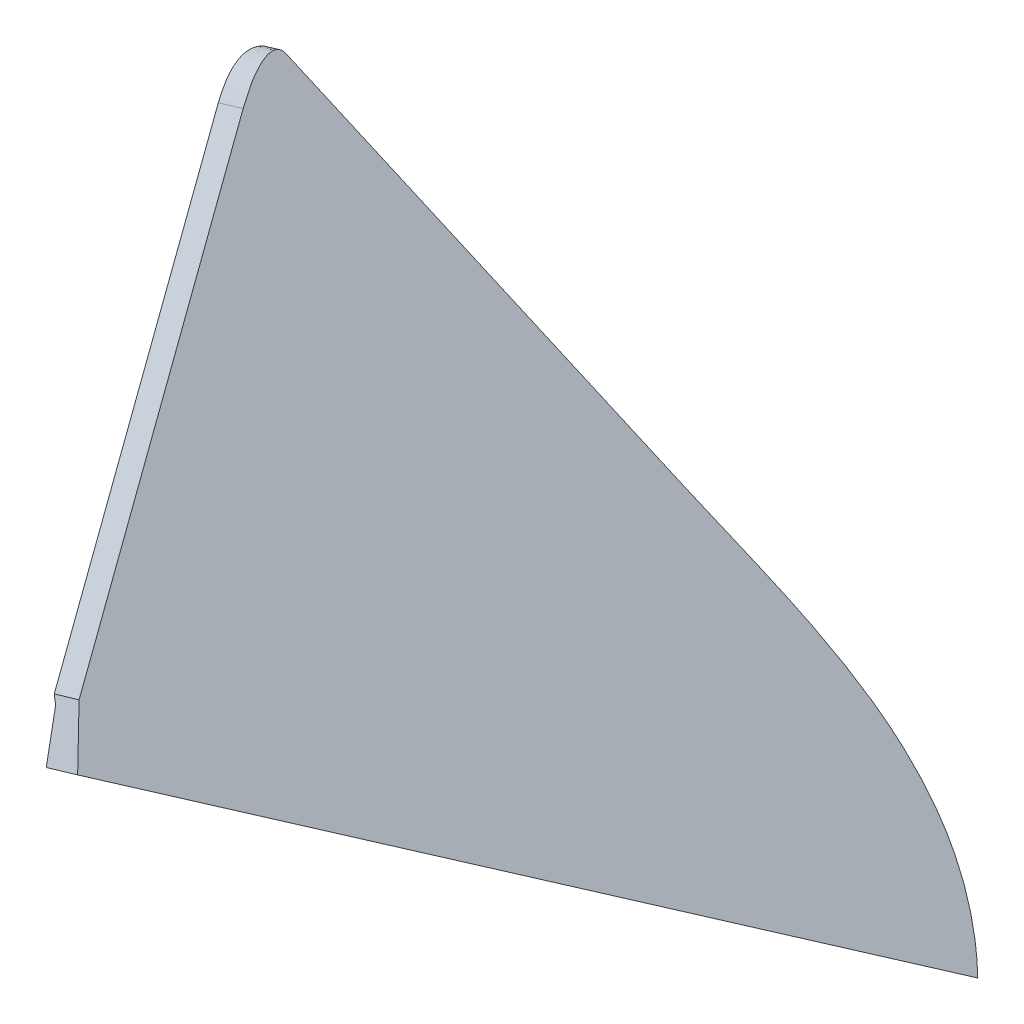
ISO-10303-21;
HEADER;
FILE_DESCRIPTION(('STEP AP214'),'2;1');
FILE_NAME('part.step','',(''),(''),'','','');
FILE_SCHEMA(('AUTOMOTIVE_DESIGN { 1 0 10303 214 1 1 1 1 }'));
ENDSEC;
DATA;
#1=APPLICATION_CONTEXT('core data for automotive mechanical design processes');
#2=APPLICATION_PROTOCOL_DEFINITION('international standard','automotive_design',2000,#1);
#3=PRODUCT_CONTEXT('',#1,'mechanical');
#4=PRODUCT('Part','Part','',(#3));
#5=PRODUCT_RELATED_PRODUCT_CATEGORY('part','',(#4));
#6=PRODUCT_DEFINITION_FORMATION('','',#4);
#7=PRODUCT_DEFINITION_CONTEXT('part definition',#1,'design');
#8=PRODUCT_DEFINITION('design','',#6,#7);
#9=PRODUCT_DEFINITION_SHAPE('','',#8);
#10=(LENGTH_UNIT() NAMED_UNIT(*) SI_UNIT(.MILLI.,.METRE.));
#11=(NAMED_UNIT(*) PLANE_ANGLE_UNIT() SI_UNIT($,.RADIAN.));
#12=(NAMED_UNIT(*) SI_UNIT($,.STERADIAN.) SOLID_ANGLE_UNIT());
#13=UNCERTAINTY_MEASURE_WITH_UNIT(LENGTH_MEASURE(1.E-05),#10,'distance_accuracy_value','');
#14=(GEOMETRIC_REPRESENTATION_CONTEXT(3) GLOBAL_UNCERTAINTY_ASSIGNED_CONTEXT((#13)) GLOBAL_UNIT_ASSIGNED_CONTEXT((#10,
#11,#12)) REPRESENTATION_CONTEXT('',''));
#15=CARTESIAN_POINT('',(0.,0.,0.));
#16=DIRECTION('',(0.,0.,1.));
#17=DIRECTION('',(1.,0.,0.));
#18=AXIS2_PLACEMENT_3D('',#15,#16,#17);
#19=CARTESIAN_POINT('',(-0.166167003981229,22.5936271303822,97.7861143687887));
#20=DIRECTION('',(-0.822868517569812,-0.469108067475573,-0.320663412041027));
#21=DIRECTION('',(0.495261223112808,-0.868744105522912,0.));
#22=AXIS2_PLACEMENT_3D('',#19,#20,#21);
#23=PLANE('',#22);
#24=CARTESIAN_POINT('',(40.5565961621778,10.4622084066012,11.0330508135531));
#25=CARTESIAN_POINT('',(41.72542417795,8.67216391951248,10.6523791746463));
#26=CARTESIAN_POINT('',(42.8644975249842,6.81434647382503,10.4472093849603));
#27=CARTESIAN_POINT('',(43.9154032623933,4.92337098868487,10.5167982697299));
#28=B_SPLINE_CURVE_WITH_KNOTS('',3,(#24,#25,#26,#27),.UNSPECIFIED.,.F.,.F.,(4,4),
(0.209452212312138,0.411613134052495),.UNSPECIFIED.);
#29=CARTESIAN_POINT('',(43.9154032623955,4.92337098868103,10.5167982697301));
#30=VERTEX_POINT('',#29);
#31=CARTESIAN_POINT('',(40.5565961621778,10.4622084066012,11.0330508135532));
#32=VERTEX_POINT('',#31);
#33=EDGE_CURVE('E181',#30,#32,#28,.F.);
#34=ORIENTED_EDGE('',*,*,#33,.T.);
#35=CARTESIAN_POINT('',(35.8873986724663,17.1562236848414,13.2208059075902));
#36=CARTESIAN_POINT('',(36.2893186171553,16.6083020717907,12.9909922859717));
#37=CARTESIAN_POINT('',(37.8568163906146,14.4519584260507,12.1231465691722));
#38=CARTESIAN_POINT('',(39.4147467872617,12.2095351544845,11.4057805712397));
#39=CARTESIAN_POINT('',(40.5484870384322,10.4739598472653,11.0354646043939));
#40=CARTESIAN_POINT('',(40.5562785080976,10.4620273155903,11.0329270270198));
#41=B_SPLINE_CURVE_WITH_KNOTS('',3,(#35,#36,#37,#38,#39,#40),.UNSPECIFIED.,.F.,.F.,(4,1,1,4),
(0.411613134052495,0.478561587695219,0.673272830838195,0.674620446285476),.UNSPECIFIED.);
#42=CARTESIAN_POINT('',(35.8877163265464,17.1564047758523,13.2209296941236));
#43=VERTEX_POINT('',#42);
#44=EDGE_CURVE('E187',#32,#43,#41,.F.);
#45=ORIENTED_EDGE('',*,*,#44,.T.);
#46=CARTESIAN_POINT('',(33.4704175288504,20.4040263738682,14.6730242236566));
#47=CARTESIAN_POINT('',(34.2780692149869,19.3309179907531,14.1703558809761));
#48=CARTESIAN_POINT('',(35.084607138838,18.2512518651785,13.6801391297867));
#49=CARTESIAN_POINT('',(35.8877163265464,17.1564047758522,13.2209296941236));
#50=B_SPLINE_CURVE_WITH_KNOTS('',3,(#46,#47,#48,#49),.UNSPECIFIED.,.F.,.F.,(4,4),
(0.674620446285477,0.808395639414886),.UNSPECIFIED.);
#51=CARTESIAN_POINT('',(33.4704175288504,20.4040263738682,14.6730242236566));
#52=VERTEX_POINT('',#51);
#53=EDGE_CURVE('E200',#43,#52,#50,.F.);
#54=ORIENTED_EDGE('',*,*,#53,.T.);
#55=CARTESIAN_POINT('',(29.9997146201673,24.9998373081739,16.8549175556399));
#56=CARTESIAN_POINT('',(30.1440663964191,24.807865731728,16.7653310427502));
#57=CARTESIAN_POINT('',(30.2884551275735,24.6161245386941,16.6753126634923));
#58=CARTESIAN_POINT('',(30.577347162018,24.2329144448707,16.4945835519247));
#59=CARTESIAN_POINT('',(30.721850488013,24.0414456877086,16.4038725512339));
#60=CARTESIAN_POINT('',(31.0109449568906,23.6586817270501,16.221971302233));
#61=CARTESIAN_POINT('',(31.1555361127854,23.4673866082519,16.1307808966243));
#62=CARTESIAN_POINT('',(31.4447798089459,23.0848708584333,15.9481335938753));
#63=CARTESIAN_POINT('',(31.5894323548886,22.8936502648049,15.8566766274649));
#64=CARTESIAN_POINT('',(31.8787723141187,22.5111845656938,15.6737090791367));
#65=CARTESIAN_POINT('',(32.0234597280094,22.3199394642105,15.5821984898199));
#66=CARTESIAN_POINT('',(32.3128429070866,21.937325737777,15.3993365867208));
#67=CARTESIAN_POINT('',(32.4575386700617,21.7459570982234,15.3079852999772));
#68=CARTESIAN_POINT('',(32.7469120978395,21.3629971798409,15.1256548746427));
#69=CARTESIAN_POINT('',(32.8915897597749,21.1714058822432,15.0346757708676));
#70=CARTESIAN_POINT('',(33.1809002551072,20.7879018711222,14.8533028087476));
#71=CARTESIAN_POINT('',(33.3255330869292,20.595989147554,14.7629089691392));
#72=CARTESIAN_POINT('',(33.470132150544,20.4038636800143,14.6729130131163));
#73=B_SPLINE_CURVE_WITH_KNOTS('',3,(#55,#56,#57,#58,#59,#60,#61,#62,#63,#64,#65,#66,#67,#68,#69,
#70,#71,#72),.UNSPECIFIED.,.F.,.F.,(4,2,2,2,2,2,2,2,4),(0.,0.76905392302072,1.53842272109634,
2.30806204615252,3.07792333052561,3.847955741788,4.6181081333238,5.38833099253364,
6.15857838856899),.UNSPECIFIED.);
#74=CARTESIAN_POINT('',(30.,25.,16.8550287652304));
#75=VERTEX_POINT('',#74);
#76=EDGE_CURVE('E463',#52,#75,#73,.F.);
#77=ORIENTED_EDGE('',*,*,#76,.T.);
#78=DIRECTION('',(-0.562957742526623,0.749727875095895,0.347831415248137));
#79=VECTOR('',#78,1.);
#80=CARTESIAN_POINT('',(33.3004571475762,20.6045640068973,14.8157945671983));
#81=LINE('',#80,#79);
#82=CARTESIAN_POINT('',(11.5058328068315,49.6298995892161,28.2819119265918));
#83=VERTEX_POINT('',#82);
#84=EDGE_CURVE('E306',#75,#83,#81,.T.);
#85=ORIENTED_EDGE('',*,*,#84,.T.);
#86=CARTESIAN_POINT('',(11.4279362314418,49.7283243298604,28.337817274586));
#87=CARTESIAN_POINT('',(11.4539931733448,49.6973187708284,28.3163103641665));
#88=CARTESIAN_POINT('',(11.4800831597117,49.6641536123502,28.297877999319));
#89=CARTESIAN_POINT('',(11.5058328068314,49.6298995892161,28.2819119265918));
#90=B_SPLINE_CURVE_WITH_KNOTS('',3,(#86,#87,#88,#89),.UNSPECIFIED.,.F.,.F.,(4,4),(0.,
0.031626096662793),.UNSPECIFIED.);
#91=CARTESIAN_POINT('',(11.4279362314418,49.7283243298605,28.337817274586));
#92=VERTEX_POINT('',#91);
#93=EDGE_CURVE('E301',#83,#92,#90,.F.);
#94=ORIENTED_EDGE('',*,*,#93,.T.);
#95=CARTESIAN_POINT('',(11.3646138940646,49.7991262724381,28.3967332429226));
#96=CARTESIAN_POINT('',(11.3855654830925,49.7773389111828,28.3748418271681));
#97=CARTESIAN_POINT('',(11.4067399241944,49.7535461443799,28.355312308458));
#98=CARTESIAN_POINT('',(11.4279362314418,49.7283243298604,28.337817274586));
#99=B_SPLINE_CURVE_WITH_KNOTS('',3,(#95,#96,#97,#98),.UNSPECIFIED.,.F.,.F.,(4,4),
(0.031626096662793,0.0573526943731981),.UNSPECIFIED.);
#100=CARTESIAN_POINT('',(11.3646138940569,49.7991262724461,28.3967332429306));
#101=VERTEX_POINT('',#100);
#102=EDGE_CURVE('E303',#92,#101,#99,.F.);
#103=ORIENTED_EDGE('',*,*,#102,.T.);
#104=CARTESIAN_POINT('',(11.2861990886802,49.8714521187899,28.4921492944665));
#105=CARTESIAN_POINT('',(11.3113243232796,49.8516335811628,28.4566674520275));
#106=CARTESIAN_POINT('',(11.3377864197017,49.827023911836,28.4247641189645));
#107=CARTESIAN_POINT('',(11.3646138940646,49.7991262724381,28.3967332429226));
#108=B_SPLINE_CURVE_WITH_KNOTS('',3,(#104,#105,#106,#107),.UNSPECIFIED.,.F.,.F.,(4,4),
(0.0573526943731981,0.0902943313823135),.UNSPECIFIED.);
#109=CARTESIAN_POINT('',(11.2861990886788,49.871452118791,28.4921492944685));
#110=VERTEX_POINT('',#109);
#111=EDGE_CURVE('E568',#101,#110,#108,.F.);
#112=ORIENTED_EDGE('',*,*,#111,.T.);
#113=CARTESIAN_POINT('',(11.2385558355234,49.9040091172962,28.5667801427225));
#114=CARTESIAN_POINT('',(11.2536579019083,49.8954968590968,28.5404789007724));
#115=CARTESIAN_POINT('',(11.2696380866806,49.88451527408,28.5155367323531));
#116=CARTESIAN_POINT('',(11.2861990886802,49.8714521187899,28.4921492944665));
#117=B_SPLINE_CURVE_WITH_KNOTS('',3,(#113,#114,#115,#116),.UNSPECIFIED.,.F.,.F.,(4,4),
(0.0902943313823135,0.11200742282504),.UNSPECIFIED.);
#118=CARTESIAN_POINT('',(11.2385558355224,49.9040091172968,28.5667801427243));
#119=VERTEX_POINT('',#118);
#120=EDGE_CURVE('E570',#110,#119,#117,.F.);
#121=ORIENTED_EDGE('',*,*,#120,.T.);
#122=CARTESIAN_POINT('',(11.1319923180947,49.9214167122341,28.8147713927585));
#123=CARTESIAN_POINT('',(11.1591752345246,49.9325216730133,28.7287703343249));
#124=CARTESIAN_POINT('',(11.1952562836658,49.9284148480045,28.6421891603172));
#125=CARTESIAN_POINT('',(11.2385558355234,49.9040091172962,28.5667801427225));
#126=B_SPLINE_CURVE_WITH_KNOTS('',3,(#122,#123,#124,#125),.UNSPECIFIED.,.F.,.F.,(4,4),
(0.11200742282504,0.174261627312847),.UNSPECIFIED.);
#127=CARTESIAN_POINT('',(11.1319923180946,49.921416712234,28.8147713927588));
#128=VERTEX_POINT('',#127);
#129=EDGE_CURVE('E573',#119,#128,#126,.F.);
#130=ORIENTED_EDGE('',*,*,#129,.T.);
#131=CARTESIAN_POINT('',(11.0716759382309,49.845471399197,29.0806545771656));
#132=CARTESIAN_POINT('',(11.0848765496264,49.8815647998481,28.9939777942388));
#133=CARTESIAN_POINT('',(11.1035706220265,49.9098056762759,28.9046916907016));
#134=CARTESIAN_POINT('',(11.1319923180947,49.9214167122341,28.8147713927585));
#135=B_SPLINE_CURVE_WITH_KNOTS('',3,(#131,#132,#133,#134),.UNSPECIFIED.,.F.,.F.,(4,4),
(0.174261627312847,0.239352879882384),.UNSPECIFIED.);
#136=CARTESIAN_POINT('',(11.071675938231,49.845471399197,29.0806545771656));
#137=VERTEX_POINT('',#136);
#138=EDGE_CURVE('E576',#128,#137,#135,.F.);
#139=ORIENTED_EDGE('',*,*,#138,.T.);
#140=CARTESIAN_POINT('',(11.0658603577472,49.827964655404,29.1211893321512));
#141=CARTESIAN_POINT('',(11.0676749262266,49.8339704431705,29.1077468419712));
#142=CARTESIAN_POINT('',(11.0696080273064,49.8398172718787,29.0942327260063));
#143=CARTESIAN_POINT('',(11.0716759382309,49.845471399197,29.0806545771656));
#144=B_SPLINE_CURVE_WITH_KNOTS('',3,(#140,#141,#142,#143),.UNSPECIFIED.,.F.,.F.,(4,4),
(0.239352879882384,0.249549597916572),.UNSPECIFIED.);
#145=CARTESIAN_POINT('',(11.0658603577484,49.8279646554076,29.1211893321432));
#146=VERTEX_POINT('',#145);
#147=EDGE_CURVE('E579',#137,#146,#144,.F.);
#148=ORIENTED_EDGE('',*,*,#147,.T.);
#149=CARTESIAN_POINT('',(11.0548337914344,49.4012697033857,29.7737098591637));
#150=CARTESIAN_POINT('',(11.0387043273079,49.5673178227106,29.5721836428791));
#151=CARTESIAN_POINT('',(11.0339235458968,49.7222614449201,29.3577801715501));
#152=CARTESIAN_POINT('',(11.0658603577472,49.827964655404,29.1211893321512));
#153=B_SPLINE_CURVE_WITH_KNOTS('',3,(#149,#150,#151,#152),.UNSPECIFIED.,.F.,.F.,(4,4),
(0.249549597916572,0.429014120226688),.UNSPECIFIED.);
#154=CARTESIAN_POINT('',(11.0548337914344,49.4012697033856,29.7737098591638));
#155=VERTEX_POINT('',#154);
#156=EDGE_CURVE('E582',#146,#155,#153,.F.);
#157=ORIENTED_EDGE('',*,*,#156,.T.);
#158=CARTESIAN_POINT('',(11.0661285474859,49.2979891516523,29.895818086647));
#159=CARTESIAN_POINT('',(11.0619088417994,49.3328597481398,29.855633224005));
#160=CARTESIAN_POINT('',(11.0581337943986,49.3672971372993,29.8149410560523));
#161=CARTESIAN_POINT('',(11.0548337914344,49.4012697033857,29.7737098591637));
#162=B_SPLINE_CURVE_WITH_KNOTS('',3,(#158,#159,#160,#161),.UNSPECIFIED.,.F.,.F.,(4,4),
(0.429014120226688,0.465731611331831),.UNSPECIFIED.);
#163=CARTESIAN_POINT('',(11.0661285474859,49.2979891516523,29.895818086647));
#164=VERTEX_POINT('',#163);
#165=EDGE_CURVE('E585',#155,#164,#162,.F.);
#166=ORIENTED_EDGE('',*,*,#165,.T.);
#167=CARTESIAN_POINT('',(11.180200847916,48.6457881921675,30.5572163597114));
#168=CARTESIAN_POINT('',(11.1309593883918,48.8738459888129,30.3499444884607));
#169=CARTESIAN_POINT('',(11.0908889362818,49.093375467492,30.1316148214576));
#170=CARTESIAN_POINT('',(11.0661285474859,49.2979891516523,29.895818086647));
#171=B_SPLINE_CURVE_WITH_KNOTS('',3,(#167,#168,#169,#170),.UNSPECIFIED.,.F.,.F.,(4,4),
(0.465731611331831,0.68118250362839),.UNSPECIFIED.);
#172=CARTESIAN_POINT('',(11.1802008479161,48.6457881921675,30.5572163597114));
#173=VERTEX_POINT('',#172);
#174=EDGE_CURVE('E588',#164,#173,#171,.F.);
#175=ORIENTED_EDGE('',*,*,#174,.T.);
#176=CARTESIAN_POINT('',(11.4391522436959,47.5980431882586,31.4254871769235));
#177=CARTESIAN_POINT('',(11.3460146908039,47.9521680030326,31.1464318058854));
#178=CARTESIAN_POINT('',(11.2530668206482,48.3083153927771,30.8639307963796));
#179=CARTESIAN_POINT('',(11.180200847916,48.6457881921675,30.5572163597114));
#180=B_SPLINE_CURVE_WITH_KNOTS('',3,(#176,#177,#178,#179),.UNSPECIFIED.,.F.,.F.,(4,4),
(0.681182503628389,1.),.UNSPECIFIED.);
#181=CARTESIAN_POINT('',(11.439152243696,47.5980431882586,31.4254871769235));
#182=VERTEX_POINT('',#181);
#183=EDGE_CURVE('E591',#173,#182,#180,.F.);
#184=ORIENTED_EDGE('',*,*,#183,.T.);
#185=DIRECTION('',(0.213079909046091,-0.777878150525178,0.591187394399135));
#186=VECTOR('',#185,1.);
#187=CARTESIAN_POINT('',(10.4010057446425,51.3879428661451,28.5451634217298));
#188=LINE('',#187,#186);
#189=CARTESIAN_POINT('',(18.3733702099096,22.2837060879459,50.6643833731611));
#190=VERTEX_POINT('',#189);
#191=EDGE_CURVE('E195',#182,#190,#188,.T.);
#192=ORIENTED_EDGE('',*,*,#191,.T.);
#193=DIRECTION('',(-0.345662221341984,0.861139754110779,-0.372767960837505));
#194=VECTOR('',#193,1.);
#195=CARTESIAN_POINT('',(3.66637369032536,58.9228832517494,34.8041106440053));
#196=LINE('',#195,#194);
#197=CARTESIAN_POINT('',(19.7550586595642,18.8415397812726,52.154419466463));
#198=VERTEX_POINT('',#197);
#199=EDGE_CURVE('E193',#190,#198,#196,.F.);
#200=ORIENTED_EDGE('',*,*,#199,.T.);
#201=DIRECTION('',(0.515226266862324,-0.377963305323162,-0.769211046309337));
#202=VECTOR('',#201,1.);
#203=CARTESIAN_POINT('',(37.6642612478582,5.70358109916498,25.4167367287374));
#204=LINE('',#203,#202);
#205=CARTESIAN_POINT('',(46.8329384353433,-1.02244154002808,11.7282890965779));
#206=VERTEX_POINT('',#205);
#207=EDGE_CURVE('E66',#198,#206,#204,.T.);
#208=ORIENTED_EDGE('',*,*,#207,.T.);
#209=CARTESIAN_POINT('',(43.9142203662931,4.92269100236904,10.5163365385976));
#210=CARTESIAN_POINT('',(45.0030279447631,2.96351552121229,10.5884356460369));
#211=CARTESIAN_POINT('',(45.9971934735886,0.968747141563538,10.9554698017756));
#212=CARTESIAN_POINT('',(46.8317531629346,-1.02311725046928,11.7278272080907));
#213=B_SPLINE_CURVE_WITH_KNOTS('',3,(#209,#210,#211,#212),.UNSPECIFIED.,.F.,.F.,(4,4),(0.,
0.209452059936682),.UNSPECIFIED.);
#214=EDGE_CURVE('E177',#206,#30,#213,.F.);
#215=ORIENTED_EDGE('',*,*,#214,.T.);
#216=EDGE_LOOP('',(#34,#45,#54,#77,#85,#94,#103,#112,#121,#130,#139,#148,#157,#166,#175,#184,
#192,#200,#208,#215));
#217=FACE_BOUND('',#216,.T.);
#218=ADVANCED_FACE('F42',(#217),#23,.F.);
#219=CARTESIAN_POINT('',(-77.0587228930359,-36.3509059125674,14.4270828842641));
#220=DIRECTION('',(-0.451004469522625,0.195897792022677,0.870757729538622));
#221=DIRECTION('',(0.887962609775484,0.,0.459915648397303));
#222=AXIS2_PLACEMENT_3D('',#219,#220,#221);
#223=PLANE('',#222);
#224=DIRECTION('',(0.635195942336929,-0.614916691346345,0.467336685423222));
#225=VECTOR('',#224,1.);
#226=CARTESIAN_POINT('',(9.78042101705722,25.9071233940204,45.3985352656473));
#227=LINE('',#226,#225);
#228=CARTESIAN_POINT('',(15.3209015538683,20.5435281109171,49.4748676808058));
#229=VERTEX_POINT('',#228);
#230=CARTESIAN_POINT('',(15.7125990587428,20.1643359315404,49.7630537371321));
#231=VERTEX_POINT('',#230);
#232=EDGE_CURVE('E557',#229,#231,#227,.T.);
#233=ORIENTED_EDGE('',*,*,#232,.T.);
#234=DIRECTION('',(-0.0503798148262376,0.968472047635712,-0.243974931512164));
#235=VECTOR('',#234,1.);
#236=CARTESIAN_POINT('',(13.1680481722711,69.0792915706992,37.4405267410063));
#237=LINE('',#236,#235);
#238=CARTESIAN_POINT('',(15.8958590314832,16.6414535695919,50.6505289978586));
#239=VERTEX_POINT('',#238);
#240=EDGE_CURVE('E559',#231,#239,#237,.F.);
#241=ORIENTED_EDGE('',*,*,#240,.T.);
#242=DIRECTION('',(0.822868517569812,0.469108067475573,0.320663412041027));
#243=VECTOR('',#242,1.);
#244=CARTESIAN_POINT('',(-77.0587228930359,-36.3509059125674,14.4270828842641));
#245=LINE('',#244,#243);
#246=EDGE_CURVE('E61',#239,#198,#245,.T.);
#247=ORIENTED_EDGE('',*,*,#246,.T.);
#248=ORIENTED_EDGE('',*,*,#199,.F.);
#249=DIRECTION('',(0.822868517569812,0.469108067475573,0.320663412041027));
#250=VECTOR('',#249,1.);
#251=CARTESIAN_POINT('',(-78.4404113426905,-32.9087396058941,12.9370467909622));
#252=LINE('',#251,#250);
#253=EDGE_CURVE('E361',#229,#190,#252,.T.);
#254=ORIENTED_EDGE('',*,*,#253,.F.);
#255=EDGE_LOOP('',(#233,#241,#247,#248,#254));
#256=FACE_BOUND('',#255,.T.);
#257=ADVANCED_FACE('F223',(#256),#223,.T.);
#258=CARTESIAN_POINT('',(-77.0587228930359,-36.3509059125674,14.4270828842641));
#259=DIRECTION('',(0.239644104303807,-0.798173766080121,0.552710903107494));
#260=DIRECTION('',(0.,-0.569299842046191,-0.822129971382981));
#261=AXIS2_PLACEMENT_3D('',#258,#259,#260);
#262=PLANE('',#261);
#263=DIRECTION('',(0.515226266862324,-0.377963305323161,-0.769211046309336));
#264=VECTOR('',#263,1.);
#265=CARTESIAN_POINT('',(35.7553320455291,4.61532207608679,24.6728466195722));
#266=LINE('',#265,#264);
#267=CARTESIAN_POINT('',(21.3893157854048,15.15404523372,46.1207018813847));
#268=VERTEX_POINT('',#267);
#269=CARTESIAN_POINT('',(44.9240092330141,-2.11070056310627,10.9843989874127));
#270=VERTEX_POINT('',#269);
#271=EDGE_CURVE('E170',#268,#270,#266,.T.);
#272=ORIENTED_EDGE('',*,*,#271,.T.);
#273=DIRECTION('',(0.822868517569812,0.469108067475573,0.320663412041027));
#274=VECTOR('',#273,1.);
#275=CARTESIAN_POINT('',(-49.9808431172567,-56.214887233868,-25.999047485621));
#276=LINE('',#275,#274);
#277=EDGE_CURVE('E166',#270,#206,#276,.T.);
#278=ORIENTED_EDGE('',*,*,#277,.T.);
#279=ORIENTED_EDGE('',*,*,#207,.F.);
#280=ORIENTED_EDGE('',*,*,#246,.F.);
#281=DIRECTION('',(-0.755227358600121,0.204485357577164,0.622749849745805));
#282=VECTOR('',#281,1.);
#283=CARTESIAN_POINT('',(45.3333970805407,8.67094584684382,26.3767494688472));
#284=LINE('',#283,#282);
#285=EDGE_CURVE('E53',#239,#268,#284,.F.);
#286=ORIENTED_EDGE('',*,*,#285,.T.);
#287=EDGE_LOOP('',(#272,#278,#279,#280,#286));
#288=FACE_BOUND('',#287,.T.);
#289=ADVANCED_FACE('F168',(#288),#262,.T.);
#290=CARTESIAN_POINT('',(-49.9808431172567,-56.2148872338681,-25.999047485621));
#291=CARTESIAN_POINT('',(-51.6262811946805,-52.2876792012306,-27.5218460367073));
#292=CARTESIAN_POINT('',(-54.960516409707,-46.4921789113465,-27.4441282596226));
#293=CARTESIAN_POINT('',(-60.8840414380416,-37.9660917370865,-24.7165767256292));
#294=CARTESIAN_POINT('',(-64.4497191852305,-33.3363831854335,-22.3394725668849));
#295=CARTESIAN_POINT('',(-66.8137815526,-30.1924456938399,-20.8723078169686));
#296=B_SPLINE_CURVE_WITH_KNOTS('',3,(#290,#291,#292,#293,#294,#295),.UNSPECIFIED.,.F.,.F.,(4,1,
1,4),(0.,0.412960749499776,0.607671992642753,1.),.UNSPECIFIED.);
#297=DIRECTION('',(0.822868517569812,0.469108067475573,0.320663412041027));
#298=VECTOR('',#297,1.);
#299=SURFACE_OF_LINEAR_EXTRUSION('',#296,#298);
#300=ORIENTED_EDGE('',*,*,#277,.F.);
#301=CARTESIAN_POINT('',(44.9240092330141,-2.11070056310629,10.9843989874127));
#302=CARTESIAN_POINT('',(44.9385596928188,-1.95123439679988,10.9626757657322));
#303=CARTESIAN_POINT('',(44.9522174283998,-1.79150550159015,10.942285343597));
#304=CARTESIAN_POINT('',(44.9777297383192,-1.47183467539899,10.9041965428719));
#305=CARTESIAN_POINT('',(44.9895870599463,-1.31189345243143,10.8864940626961));
#306=CARTESIAN_POINT('',(45.0115131470875,-0.99180120775035,10.8537593410483));
#307=CARTESIAN_POINT('',(45.0215839397715,-0.831650634250068,10.8387240730975));
#308=CARTESIAN_POINT('',(45.0399522652653,-0.511142869056031,10.8113009392612));
#309=CARTESIAN_POINT('',(45.048251121159,-0.350785922106629,10.7989110980677));
#310=CARTESIAN_POINT('',(45.0630905666295,-0.0298685150472454,10.7767564329989));
#311=CARTESIAN_POINT('',(45.0696317955223,0.130691849662952,10.7669906546518));
#312=CARTESIAN_POINT('',(45.0809705987107,0.452003056593494,10.7500623005958));
#313=CARTESIAN_POINT('',(45.085768259881,0.612753888923099,10.7428995951864));
#314=CARTESIAN_POINT('',(45.0936354123436,0.9344555595305,10.7311542689746));
#315=CARTESIAN_POINT('',(45.0967042192693,1.09540645177121,10.7265726699024));
#316=CARTESIAN_POINT('',(45.1011284336024,1.4175078520763,10.7199675048416));
#317=CARTESIAN_POINT('',(45.1024825223927,1.5786584184875,10.7179459074926));
#318=CARTESIAN_POINT('',(45.1034917487701,1.90115867049113,10.7164391751545));
#319=CARTESIAN_POINT('',(45.103144963209,2.06250837515934,10.7169569113444));
#320=CARTESIAN_POINT('',(45.1007672646127,2.38540704085494,10.7205067148826));
#321=CARTESIAN_POINT('',(45.0987338560088,2.54695594272884,10.7235425080096));
#322=CARTESIAN_POINT('',(45.0958673159484,2.70845633332593,10.7278221311983));
#323=B_SPLINE_CURVE_WITH_KNOTS('',3,(#301,#302,#303,#304,#305,#306,#307,#308,#309,#310,#311,
#312,#313,#314,#315,#316,#317,#318,#319,#320,#321,#322),.UNSPECIFIED.,.F.,.F.,(4,2,2,2,2,2,2,2,
2,2,4),(0.,0.48477760213879,0.968807872962693,1.45228535303231,1.9354005539827,2.41833978886846,
2.90125495755962,3.38436115398484,3.86783863357196,4.35186289843632,4.8366046176863),.UNSPECIFIED.);
#324=CARTESIAN_POINT('',(44.9576057817014,-1.72275123301942,10.9342407597945));
#325=VERTEX_POINT('',#324);
#326=EDGE_CURVE('E12',#270,#325,#323,.T.);
#327=ORIENTED_EDGE('',*,*,#326,.T.);
#328=CARTESIAN_POINT('',(45.0826032089166,-2.02028792492613,11.0462014313709));
#329=CARTESIAN_POINT('',(45.0007520363812,-1.82366095413664,10.9702157488685));
#330=CARTESIAN_POINT('',(44.91712243077,-1.62636222819967,10.897952202115));
#331=CARTESIAN_POINT('',(44.7464366701683,-1.23069460526122,10.7608296437075));
#332=CARTESIAN_POINT('',(44.6593807629015,-1.03232578651966,10.6959700980577));
#333=CARTESIAN_POINT('',(44.3937766617537,-0.437159489244886,10.5127848295765));
#334=CARTESIAN_POINT('',(44.2103054969941,-0.0391338478476004,10.4054028361511));
#335=CARTESIAN_POINT('',(43.8317351769015,0.757536709815636,10.2192066643149));
#336=CARTESIAN_POINT('',(43.6366462755905,1.15618078617852,10.1403677160313));
#337=CARTESIAN_POINT('',(43.2408072837573,1.943203805265,10.011363864647));
#338=CARTESIAN_POINT('',(43.0403009433658,2.3316021169976,9.96056366895281));
#339=CARTESIAN_POINT('',(42.630522692759,3.10647207337811,9.88329706217337));
#340=CARTESIAN_POINT('',(42.421245245216,3.49294232316717,9.85684627273214));
#341=CARTESIAN_POINT('',(41.9952244301672,4.26273660226299,9.82665217757078));
#342=CARTESIAN_POINT('',(41.778478870559,4.64605966618567,9.82291559721154));
#343=CARTESIAN_POINT('',(41.2465296306794,5.56854092421378,9.83925166525577));
#344=CARTESIAN_POINT('',(40.9281325627901,6.10568056049062,9.86995913004453));
#345=CARTESIAN_POINT('',(40.2815318751498,7.17057178493396,9.96868984715001));
#346=CARTESIAN_POINT('',(39.9533255884166,7.69832075653758,10.0367233367544));
#347=CARTESIAN_POINT('',(39.2895203311336,8.74384525892066,10.2054723041426));
#348=CARTESIAN_POINT('',(38.9539205553335,9.26161969171247,10.3061913583898));
#349=CARTESIAN_POINT('',(38.2718140278207,10.2955025013636,10.5380138695314));
#350=CARTESIAN_POINT('',(37.9252186584568,10.8114458874041,10.6695862215817));
#351=CARTESIAN_POINT('',(37.2281563836815,11.8333552112206,10.957812266341));
#352=CARTESIAN_POINT('',(36.8776903930018,12.3393234308752,11.1144601463146));
#353=CARTESIAN_POINT('',(36.1739930800503,13.3423166202742,11.4484544463989));
#354=CARTESIAN_POINT('',(35.820761891611,13.839342019048,11.6257998704785));
#355=CARTESIAN_POINT('',(35.0712879619541,14.8828573258675,12.0182891986907));
#356=CARTESIAN_POINT('',(34.6747994133164,15.4284132921169,12.2354321778394));
#357=CARTESIAN_POINT('',(33.8802275676978,16.5118318851525,12.6853695284586));
#358=CARTESIAN_POINT('',(33.4821442130763,17.0496942306,12.9181644705215));
#359=CARTESIAN_POINT('',(32.6849423718727,18.119850617727,13.3949615514171));
#360=CARTESIAN_POINT('',(32.2858236520977,18.6521432386678,13.6389664680865));
#361=CARTESIAN_POINT('',(31.4989698349054,19.6975011018294,14.1263593618108));
#362=CARTESIAN_POINT('',(31.11124804494,20.2106685279846,14.3695511687199));
#363=CARTESIAN_POINT('',(30.3358926392895,21.2357151597954,14.8582281762112));
#364=CARTESIAN_POINT('',(29.948259028856,21.7475946823283,15.103712724278));
#365=CARTESIAN_POINT('',(29.367323416267,22.5160669958784,15.4706999058535));
#366=CARTESIAN_POINT('',(29.1738333502172,22.7722412322532,15.5927787762636));
#367=CARTESIAN_POINT('',(28.7870697683495,23.2851645262758,15.8360741508586));
#368=CARTESIAN_POINT('',(28.5937962538946,23.5419135875118,15.9572906496407));
#369=CARTESIAN_POINT('',(28.4006779341403,23.7990966193511,16.0778357229223));
#370=B_SPLINE_CURVE_WITH_KNOTS('',3,(#328,#329,#330,#331,#332,#333,#334,#335,#336,#337,#338,
#339,#340,#341,#342,#343,#344,#345,#346,#347,#348,#349,#350,#351,#352,#353,#354,#355,#356,#357,
#358,#359,#360,#361,#362,#363,#364,#365,#366,#367,#368,#369),.UNSPECIFIED.,.F.,.F.,(4,2,2,2,2,2,
2,2,2,2,2,2,2,2,2,2,2,2,2,2,4),(0.,0.678313855497362,1.3565787582844,2.70908878868063,
4.06042227111341,5.37972910820656,6.6998817732097,8.0204252979947,9.89441144043743,
11.7689118120972,13.6436173612883,15.5489075517005,17.4537567163954,19.3585142515014,
21.4837556417766,23.6090745498025,25.7349229838215,27.7977473488049,29.8600015132561,
30.890389394027,31.920783724462),.UNSPECIFIED.);
#371=CARTESIAN_POINT('',(28.4006779341402,23.799096619351,16.0778357229223));
#372=VERTEX_POINT('',#371);
#373=EDGE_CURVE('E464',#325,#372,#370,.T.);
#374=ORIENTED_EDGE('',*,*,#373,.T.);
#375=CARTESIAN_POINT('',(28.4006779341403,23.799096619351,16.0778357229223));
#376=CARTESIAN_POINT('',(28.3753453205647,23.8328337280395,16.0936492310809));
#377=CARTESIAN_POINT('',(28.3500094549205,23.8665751677218,16.1094482594292));
#378=CARTESIAN_POINT('',(28.2993312194951,23.9340667090737,16.141017356505));
#379=CARTESIAN_POINT('',(28.2739888497138,23.9678168107433,16.1567874252325));
#380=CARTESIAN_POINT('',(28.248643227864,24.0015712434068,16.1725430141497));
#381=B_SPLINE_CURVE_WITH_KNOTS('',3,(#375,#376,#377,#378,#379,#380),.UNSPECIFIED.,.F.,.F.,(4,2,
4),(0.,0.13516656845774,0.270333136915489),.UNSPECIFIED.);
#382=CARTESIAN_POINT('',(28.248643227864,24.0015712434067,16.1725430141497));
#383=VERTEX_POINT('',#382);
#384=EDGE_CURVE('E455',#372,#383,#381,.T.);
#385=ORIENTED_EDGE('',*,*,#384,.T.);
#386=DIRECTION('',(0.822868517569812,0.469108067475573,0.320663412041027));
#387=VECTOR('',#386,1.);
#388=CARTESIAN_POINT('',(-66.8137815526,-30.1924456938399,-20.8723078169686));
#389=LINE('',#388,#387);
#390=EDGE_CURVE('E174',#383,#75,#389,.T.);
#391=ORIENTED_EDGE('',*,*,#390,.T.);
#392=ORIENTED_EDGE('',*,*,#76,.F.);
#393=ORIENTED_EDGE('',*,*,#53,.F.);
#394=ORIENTED_EDGE('',*,*,#44,.F.);
#395=ORIENTED_EDGE('',*,*,#33,.F.);
#396=ORIENTED_EDGE('',*,*,#214,.F.);
#397=EDGE_LOOP('',(#300,#327,#374,#385,#391,#392,#393,#394,#395,#396));
#398=FACE_BOUND('',#397,.T.);
#399=ADVANCED_FACE('F179',(#398),#299,.T.);
#400=CARTESIAN_POINT('',(-85.3079487457686,-5.56254610462386,-9.44542465560717));
#401=CARTESIAN_POINT('',(-85.3546447277995,-5.50042776795998,-9.4164708046394));
#402=CARTESIAN_POINT('',(-85.4299235752478,-5.40826819073394,-9.35811742932534));
#403=CARTESIAN_POINT('',(-85.5198994080202,-5.3245909394452,-9.24964042452658));
#404=CARTESIAN_POINT('',(-85.6059408800436,-5.26546322887993,-9.11534530110792));
#405=CARTESIAN_POINT('',(-85.6982414265703,-5.25495737603401,-8.89385812515121));
#406=CARTESIAN_POINT('',(-85.78186361386,-5.40518315163336,-8.45950177722584));
#407=CARTESIAN_POINT('',(-85.7598666497148,-6.11809784259651,-7.47300499649864));
#408=CARTESIAN_POINT('',(-85.5414339171305,-6.96018301883892,-6.80162334601279));
#409=CARTESIAN_POINT('',(-85.3746293089041,-7.59440250558137,-6.30184940527546));
#410=B_SPLINE_CURVE_WITH_KNOTS('',3,(#400,#401,#402,#403,#404,#405,#406,#407,#408,#409),
.UNSPECIFIED.,.F.,.F.,(4,1,1,1,1,1,1,4),(0.,0.0573526943731981,0.0902943313823135,
0.11200742282504,0.174261627312847,0.249549597916572,0.429014120226688,1.),.UNSPECIFIED.);
#411=DIRECTION('',(0.822868517569812,0.469108067475573,0.320663412041027));
#412=VECTOR('',#411,1.);
#413=SURFACE_OF_LINEAR_EXTRUSION('',#410,#412);
#414=CARTESIAN_POINT('',(9.75447603469544,48.6314708326228,27.5994261755111));
#415=CARTESIAN_POINT('',(9.74192593256785,48.6481846295738,27.6072191215546));
#416=CARTESIAN_POINT('',(9.72950860324008,48.6647216042486,27.6156586263944));
#417=CARTESIAN_POINT('',(9.70503359595257,48.6973165822022,27.634037013103));
#418=CARTESIAN_POINT('',(9.69297723241863,48.7133728349735,27.6439807259913));
#419=CARTESIAN_POINT('',(9.66925228955831,48.7449689027672,27.6656621669092));
#420=CARTESIAN_POINT('',(9.65759060556218,48.7604995348245,27.6774211325837));
#421=CARTESIAN_POINT('',(9.63502815876047,48.7905474301074,27.7027673660467));
#422=CARTESIAN_POINT('',(9.62412634288521,48.8050660957752,27.7163520239711));
#423=CARTESIAN_POINT('',(9.5991876435948,48.8382786028844,27.7510753173759));
#424=CARTESIAN_POINT('',(9.58558461140976,48.8563946560929,27.7730947054928));
#425=CARTESIAN_POINT('',(9.56081404432329,48.8893832504851,27.8204458574037));
#426=CARTESIAN_POINT('',(9.54963106710472,48.9042763572189,27.8457548632943));
#427=CARTESIAN_POINT('',(9.53501753423075,48.923738160693,27.8859252085813));
#428=CARTESIAN_POINT('',(9.5305001367897,48.9297542761648,27.8997108287962));
#429=CARTESIAN_POINT('',(9.52222774226814,48.9407711683724,27.9279038537851));
#430=CARTESIAN_POINT('',(9.51847288683113,48.9457717564723,27.9423113734766));
#431=CARTESIAN_POINT('',(9.50825812074136,48.9593754327279,27.9863567779179));
#432=CARTESIAN_POINT('',(9.50288699555047,48.9665285136292,28.0167070347606));
#433=CARTESIAN_POINT('',(9.49559510192522,48.9762396082641,28.0718877899703));
#434=CARTESIAN_POINT('',(9.49318898632422,48.9794439907612,28.0965530362585));
#435=CARTESIAN_POINT('',(9.48990294785889,48.9838202244462,28.1459442076141));
#436=CARTESIAN_POINT('',(9.48900956133585,48.9850100060745,28.1706676148846));
#437=CARTESIAN_POINT('',(9.4887992058347,48.9852901503393,28.1953967676316));
#438=B_SPLINE_CURVE_WITH_KNOTS('',3,(#414,#415,#416,#417,#418,#419,#420,#421,#422,#423,#424,
#425,#426,#427,#428,#429,#430,#431,#432,#433,#434,#435,#436,#437),.UNSPECIFIED.,.F.,.F.,(4,2,2,
2,2,2,2,2,2,2,2,4),(0.,0.0669372428573807,0.134094218728702,0.202106592800258,0.270022755944454,
0.364405479256265,0.458166925522348,0.505222962510744,0.552287732261075,0.646796766526371,
0.721644087547428,0.795821677977686),.UNSPECIFIED.);
#439=CARTESIAN_POINT('',(9.75447603469547,48.6314708326228,27.5994261755111));
#440=VERTEX_POINT('',#439);
#441=CARTESIAN_POINT('',(9.53023116854623,48.9301124788522,27.9010635611751));
#442=VERTEX_POINT('',#441);
#443=EDGE_CURVE('E436',#440,#442,#438,.T.);
#444=ORIENTED_EDGE('',*,*,#443,.T.);
#445=CARTESIAN_POINT('',(10.3967999107725,48.9976524348669,27.849733194604));
#446=CARTESIAN_POINT('',(10.3287318308349,49.0022458604607,27.8462421911526));
#447=CARTESIAN_POINT('',(10.260389227708,49.0049491750718,27.8441876720483));
#448=CARTESIAN_POINT('',(10.1233879857387,49.0059615582175,27.8434182608575));
#449=CARTESIAN_POINT('',(10.0547291813316,49.0042529095935,27.8447168338117));
#450=CARTESIAN_POINT('',(9.91738481282847,48.9957494576398,27.8511794572965));
#451=CARTESIAN_POINT('',(9.8487027119198,48.988917617963,27.8563716554509));
#452=CARTESIAN_POINT('',(9.71263179208623,48.9697741876409,27.8709206624957));
#453=CARTESIAN_POINT('',(9.64524083508552,48.9574726551069,27.8802698272216));
#454=CARTESIAN_POINT('',(9.556591627757,48.9368614989126,27.8959343059292));
#455=CARTESIAN_POINT('',(9.5343051685207,48.9312940142092,27.9001655943038));
#456=CARTESIAN_POINT('',(9.49004503824754,48.9194211797938,27.9091889484595));
#457=CARTESIAN_POINT('',(9.46807135502392,48.9131158589191,27.9139809923242));
#458=CARTESIAN_POINT('',(9.40264577714598,48.8931393459029,27.9291631422166));
#459=CARTESIAN_POINT('',(9.3596965186601,48.8784092758036,27.9403579954921));
#460=CARTESIAN_POINT('',(9.27560439239187,48.8463422977764,27.9647288987927));
#461=CARTESIAN_POINT('',(9.23445430670049,48.8290173396359,27.9778958669795));
#462=CARTESIAN_POINT('',(9.15408390332589,48.7917377469391,28.0062283574291));
#463=CARTESIAN_POINT('',(9.11486298608472,48.7717839365751,28.0213932533057));
#464=CARTESIAN_POINT('',(9.0386970583578,48.7290972789391,28.053835113109));
#465=CARTESIAN_POINT('',(9.00175938989685,48.7063561035651,28.0711184063933));
#466=CARTESIAN_POINT('',(8.93058907609377,48.6583311011227,28.1076174082495));
#467=CARTESIAN_POINT('',(8.89635667907796,48.633047041117,28.1268332938539));
#468=CARTESIAN_POINT('',(8.83066510405954,48.5802279950231,28.1669757688852));
#469=CARTESIAN_POINT('',(8.79921027948222,48.5526896013534,28.1879049480742));
#470=CARTESIAN_POINT('',(8.73884821785184,48.4958937842166,28.2310697690982));
#471=CARTESIAN_POINT('',(8.70994166368377,48.4666359034414,28.2533057584873));
#472=CARTESIAN_POINT('',(8.65409461740912,48.4057567705899,28.2995738994545));
#473=CARTESIAN_POINT('',(8.62722613291479,48.3740935272003,28.3236379644306));
#474=CARTESIAN_POINT('',(8.57654284548705,48.3092729786743,28.3729015813103));
#475=CARTESIAN_POINT('',(8.55272678631359,48.2761162958119,28.3981006602858));
#476=CARTESIAN_POINT('',(8.50818524311466,48.2085483951619,28.4494522647797));
#477=CARTESIAN_POINT('',(8.48745741976056,48.1741381517871,28.4756040497446));
#478=CARTESIAN_POINT('',(8.44894161060187,48.1042785467705,28.5286973495572));
#479=CARTESIAN_POINT('',(8.4311548648921,48.0688287541861,28.5556391919213));
#480=CARTESIAN_POINT('',(8.39898614489726,47.9987499104085,28.6088991131924));
#481=CARTESIAN_POINT('',(8.38448808392083,47.9641542757309,28.6351917955473));
#482=CARTESIAN_POINT('',(8.35752484503702,47.8944590693597,28.6881601523894));
#483=CARTESIAN_POINT('',(8.34506028427834,47.8593593481838,28.7148359404831));
#484=CARTESIAN_POINT('',(8.32182578677649,47.7887794084737,28.7684766946628));
#485=CARTESIAN_POINT('',(8.31105711046707,47.7532989276714,28.7954418600725));
#486=CARTESIAN_POINT('',(8.29127831970113,47.682036073834,28.8496016289889));
#487=CARTESIAN_POINT('',(8.28226792155836,47.6462537504727,28.8767961947436));
#488=CARTESIAN_POINT('',(8.25769158462387,47.5379050602184,28.9591411993368));
#489=CARTESIAN_POINT('',(8.2447806737876,47.4649467102791,29.0145895452907));
#490=CARTESIAN_POINT('',(8.22566231725393,47.3185577918975,29.1258451232607));
#491=CARTESIAN_POINT('',(8.21944943008901,47.2451276555995,29.1816520268472));
#492=CARTESIAN_POINT('',(8.21142218084198,47.0598933194256,29.3224301223393));
#493=CARTESIAN_POINT('',(8.21357208394258,46.947979859638,29.4074843517779));
#494=CARTESIAN_POINT('',(8.22884534334047,46.7246112175452,29.5772445197684));
#495=CARTESIAN_POINT('',(8.24197874267847,46.6131565485104,29.6619500682349));
#496=CARTESIAN_POINT('',(8.26707660089458,46.4479839391354,29.7874812513599));
#497=CARTESIAN_POINT('',(8.27618635860697,46.3939695653327,29.82853217545));
#498=CARTESIAN_POINT('',(8.2957688423892,46.2861254097631,29.9104937336829));
#499=CARTESIAN_POINT('',(8.30624090452052,46.2322955511018,29.9514044262654));
#500=CARTESIAN_POINT('',(8.33899722888158,46.0714526697964,30.0736450160576));
#501=CARTESIAN_POINT('',(8.36270021684764,45.9646168730502,30.1548402215846));
#502=CARTESIAN_POINT('',(8.38668358765467,45.8578652112298,30.2359714845681));
#503=B_SPLINE_CURVE_WITH_KNOTS('',3,(#445,#446,#447,#448,#449,#450,#451,#452,#453,#454,#455,
#456,#457,#458,#459,#460,#461,#462,#463,#464,#465,#466,#467,#468,#469,#470,#471,#472,#473,#474,
#475,#476,#477,#478,#479,#480,#481,#482,#483,#484,#485,#486,#487,#488,#489,#490,#491,#492,#493,
#494,#495,#496,#497,#498,#499,#500,#501,#502),.UNSPECIFIED.,.F.,.F.,(4,2,2,2,2,2,2,2,2,2,2,2,2,
2,2,2,2,2,2,2,2,2,2,2,2,2,2,2,4),(0.,0.20500816760722,0.410840867428792,0.618176083802682,
0.825131602236555,0.895188498588921,0.965242657782956,1.10537330624518,1.24487742220087,
1.38433790472896,1.5242257183828,1.6641263579496,1.80424251654753,1.94439611002273,
2.0882480269743,2.23204054957457,2.37572358988626,2.51946705999622,2.65682997997122,
2.79423451109281,2.9317406883913,3.06922466162487,3.34656086342943,3.62367158741234,
4.04480504698483,4.46632400226688,4.67167005731271,4.87691640635454,5.28562500552937),.UNSPECIFIED.);
#504=CARTESIAN_POINT('',(8.38668358765467,45.8578652112298,30.2359714845681));
#505=VERTEX_POINT('',#504);
#506=EDGE_CURVE('E429',#442,#505,#503,.T.);
#507=ORIENTED_EDGE('',*,*,#506,.T.);
#508=DIRECTION('',(0.822868517569812,0.469108067475573,0.320663412041027));
#509=VECTOR('',#508,1.);
#510=CARTESIAN_POINT('',(-85.3746293089041,-7.59440250558137,-6.30184940527546));
#511=LINE('',#510,#509);
#512=EDGE_CURVE('E438',#505,#182,#511,.T.);
#513=ORIENTED_EDGE('',*,*,#512,.T.);
#514=ORIENTED_EDGE('',*,*,#183,.F.);
#515=ORIENTED_EDGE('',*,*,#174,.F.);
#516=ORIENTED_EDGE('',*,*,#165,.F.);
#517=ORIENTED_EDGE('',*,*,#156,.F.);
#518=ORIENTED_EDGE('',*,*,#147,.F.);
#519=ORIENTED_EDGE('',*,*,#138,.F.);
#520=ORIENTED_EDGE('',*,*,#129,.F.);
#521=ORIENTED_EDGE('',*,*,#120,.F.);
#522=ORIENTED_EDGE('',*,*,#111,.F.);
#523=ORIENTED_EDGE('',*,*,#102,.F.);
#524=ORIENTED_EDGE('',*,*,#93,.F.);
#525=DIRECTION('',(0.822868517569812,0.469108067475573,0.320663412041027));
#526=VECTOR('',#525,1.);
#527=CARTESIAN_POINT('',(-85.3079487457686,-5.56254610462385,-9.44542465560717));
#528=LINE('',#527,#526);
#529=EDGE_CURVE('E482',#440,#83,#528,.T.);
#530=ORIENTED_EDGE('',*,*,#529,.F.);
#531=EDGE_LOOP('',(#444,#507,#513,#514,#515,#516,#517,#518,#519,#520,#521,#522,#523,#524,#530));
#532=FACE_BOUND('',#531,.T.);
#533=ADVANCED_FACE('F344',(#532),#413,.T.);
#534=CARTESIAN_POINT('',(-78.4404113426905,-32.9087396058941,12.9370467909622));
#535=DIRECTION('',(-0.526767838002065,0.418142564163065,0.740048944923083));
#536=DIRECTION('',(0.814689658210966,0.,0.579897198479265));
#537=AXIS2_PLACEMENT_3D('',#534,#535,#536);
#538=PLANE('',#537);
#539=DIRECTION('',(0.213079909046091,-0.777878150525178,0.591187394399135));
#540=VECTOR('',#539,1.);
#541=CARTESIAN_POINT('',(7.34853708860123,49.6477648891163,27.3556477293744));
#542=LINE('',#541,#540);
#543=EDGE_CURVE('E446',#505,#229,#542,.T.);
#544=ORIENTED_EDGE('',*,*,#543,.T.);
#545=ORIENTED_EDGE('',*,*,#253,.T.);
#546=ORIENTED_EDGE('',*,*,#191,.F.);
#547=ORIENTED_EDGE('',*,*,#512,.F.);
#548=EDGE_LOOP('',(#544,#545,#546,#547));
#549=FACE_BOUND('',#548,.T.);
#550=ADVANCED_FACE('F369',(#549),#538,.T.);
#551=CARTESIAN_POINT('',(-85.3079487457686,-5.56254610462385,-9.44542465560717));
#552=DIRECTION('',(0.0772397755161718,0.466739471582945,-0.881015483828));
#553=DIRECTION('',(0.,0.883655363491066,0.468138012314181));
#554=AXIS2_PLACEMENT_3D('',#551,#552,#553);
#555=PLANE('',#554);
#556=DIRECTION('',(-0.562957742526623,0.749727875095895,0.347831415248137));
#557=VECTOR('',#556,1.);
#558=CARTESIAN_POINT('',(31.5491003754402,19.6061352503041,14.1333088161176));
#559=LINE('',#558,#557);
#560=EDGE_CURVE('E437',#383,#440,#559,.T.);
#561=ORIENTED_EDGE('',*,*,#560,.T.);
#562=ORIENTED_EDGE('',*,*,#529,.T.);
#563=ORIENTED_EDGE('',*,*,#84,.F.);
#564=ORIENTED_EDGE('',*,*,#390,.F.);
#565=EDGE_LOOP('',(#561,#562,#563,#564));
#566=FACE_BOUND('',#565,.T.);
#567=ADVANCED_FACE('F345',(#566),#555,.T.);
#568=CARTESIAN_POINT('',(-1.81190403912085,21.6554109954311,97.1447875447067));
#569=DIRECTION('',(-0.822868517569812,-0.469108067475573,-0.320663412041027));
#570=DIRECTION('',(0.495261223112808,-0.868744105522912,0.));
#571=AXIS2_PLACEMENT_3D('',#568,#569,#570);
#572=PLANE('',#571);
#573=DIRECTION('',(0.515226266862324,-0.377963305323162,-0.769211046309337));
#574=VECTOR('',#573,1.);
#575=CARTESIAN_POINT('',(35.8881073315529,5.1997396528918,24.47461872776));
#576=LINE('',#575,#574);
#577=CARTESIAN_POINT('',(21.6420283545841,15.6504783755524,45.7434126935921));
#578=VERTEX_POINT('',#577);
#579=CARTESIAN_POINT('',(44.7891230266751,-1.32992998788513,11.1857783940617));
#580=VERTEX_POINT('',#579);
#581=EDGE_CURVE('E186',#578,#580,#576,.T.);
#582=ORIENTED_EDGE('',*,*,#581,.F.);
#583=DIRECTION('',(0.553428001528997,-0.789599481927916,-0.265047364187584));
#584=VECTOR('',#583,1.);
#585=CARTESIAN_POINT('',(4.29463198870792,40.4007532901771,54.0514160284249));
#586=LINE('',#585,#584);
#587=CARTESIAN_POINT('',(16.8761868961555,22.4501089257399,48.0258662615405));
#588=VERTEX_POINT('',#587);
#589=EDGE_CURVE('E311',#578,#588,#586,.F.);
#590=ORIENTED_EDGE('',*,*,#589,.T.);
#591=DIRECTION('',(0.213079909046091,-0.777878150525178,0.591187394399135));
#592=VECTOR('',#591,1.);
#593=CARTESIAN_POINT('',(9.33175483353834,49.9921183338725,27.0939391113597));
#594=LINE('',#593,#592);
#595=CARTESIAN_POINT('',(9.67575007134893,48.7363153791242,28.0483493569684));
#596=VERTEX_POINT('',#595);
#597=EDGE_CURVE('E626',#596,#588,#594,.T.);
#598=ORIENTED_EDGE('',*,*,#597,.F.);
#599=DIRECTION('',(-0.562957742526623,0.749727875095895,0.347831415248137));
#600=VECTOR('',#599,1.);
#601=CARTESIAN_POINT('',(31.6274811996218,19.5017503483428,14.4851613435578));
#602=LINE('',#601,#600);
#603=CARTESIAN_POINT('',(28.4006779341403,23.7990966193511,16.4788874472656));
#604=VERTEX_POINT('',#603);
#605=EDGE_CURVE('E618',#604,#596,#602,.T.);
#606=ORIENTED_EDGE('',*,*,#605,.F.);
#607=CARTESIAN_POINT('',(44.7891230266751,-1.32992998788513,11.1857783940617));
#608=CARTESIAN_POINT('',(44.7049911312404,-1.1360165821554,11.1179912561267));
#609=CARTESIAN_POINT('',(44.6192244661105,-0.941616617196171,11.0536873707666));
#610=CARTESIAN_POINT('',(44.4445446021779,-0.552062434788705,10.9320506403571));
#611=CARTESIAN_POINT('',(44.3556315520706,-0.356908253371355,10.874717466444));
#612=CARTESIAN_POINT('',(44.0848089498973,0.228382570741853,10.7134478850253));
#613=CARTESIAN_POINT('',(43.8983832157034,0.619344135937949,10.6198938478421));
#614=CARTESIAN_POINT('',(43.5149132167353,1.40118903247542,10.4601489035376));
#615=CARTESIAN_POINT('',(43.317877293144,1.79207218963402,10.3939368465566));
#616=CARTESIAN_POINT('',(42.9190362528783,2.56344276766882,10.2889594018094));
#617=CARTESIAN_POINT('',(42.7174476094357,2.94396110561836,10.2495932830318));
#618=CARTESIAN_POINT('',(42.306378658567,3.70266790115003,10.1945206437813));
#619=CARTESIAN_POINT('',(42.0968942098404,4.08085501154366,10.1788267213245));
#620=CARTESIAN_POINT('',(41.6712756799227,4.83379422610639,10.169527964452));
#621=CARTESIAN_POINT('',(41.4551402120541,5.20854559252387,10.1759277677294));
#622=CARTESIAN_POINT('',(40.9116685932597,6.13372917446607,10.217075596319));
#623=CARTESIAN_POINT('',(40.580999133907,6.68167657344469,10.2640124835499));
#624=CARTESIAN_POINT('',(39.9104177339565,7.76723231793627,10.3967291061942));
#625=CARTESIAN_POINT('',(39.5705018146273,8.30483603712003,10.4825258196007));
#626=CARTESIAN_POINT('',(38.8838532532551,9.36934462393478,10.687263608044));
#627=CARTESIAN_POINT('',(38.537119037359,9.89624696295196,10.8062124209992));
#628=CARTESIAN_POINT('',(37.8331951398052,10.947903656342,11.0740826293006));
#629=CARTESIAN_POINT('',(37.4759269011406,11.4724897797576,11.2234517233295));
#630=CARTESIAN_POINT('',(36.757918789687,12.5115497010255,11.5458922473652));
#631=CARTESIAN_POINT('',(36.3971801312154,13.0260268571479,11.7189556483454));
#632=CARTESIAN_POINT('',(35.6732095023019,14.0461845055906,12.0843495498541));
#633=CARTESIAN_POINT('',(35.3099777268001,14.5518656749957,12.2766785596106));
#634=CARTESIAN_POINT('',(34.579731341535,15.5586652862228,12.6777188271215));
#635=CARTESIAN_POINT('',(34.2127069447308,16.0597421128556,12.8865160799343));
#636=CARTESIAN_POINT('',(33.4774833800285,17.0559744757793,13.3157876496625));
#637=CARTESIAN_POINT('',(33.1092841950469,17.5511299254611,13.5362621371196));
#638=CARTESIAN_POINT('',(32.3720939288241,18.5372557695003,13.985365674165));
#639=CARTESIAN_POINT('',(32.0031027259242,19.0282254532194,14.2139960755612));
#640=CARTESIAN_POINT('',(31.2746852793411,19.9944919320813,14.6696401509063));
#641=CARTESIAN_POINT('',(30.9152692326004,20.469854546906,14.8965313684566));
#642=CARTESIAN_POINT('',(30.1964198543467,21.4199459278902,15.3512854348865));
#643=CARTESIAN_POINT('',(29.83698653752,21.8946747925193,15.5791481020247));
#644=CARTESIAN_POINT('',(29.2980805107623,22.6077406892294,15.9188932505771));
#645=CARTESIAN_POINT('',(29.1185261368874,22.8455378900953,16.0317750286191));
#646=CARTESIAN_POINT('',(28.7595160076153,23.3217703632977,16.2563520616996));
#647=CARTESIAN_POINT('',(28.5800602533409,23.5602056427261,16.3680473034813));
#648=CARTESIAN_POINT('',(28.4006779341403,23.7990966193511,16.4788874472656));
#649=B_SPLINE_CURVE_WITH_KNOTS('',3,(#607,#608,#609,#610,#611,#612,#613,#614,#615,#616,#617,
#618,#619,#620,#621,#622,#623,#624,#625,#626,#627,#628,#629,#630,#631,#632,#633,#634,#635,#636,
#637,#638,#639,#640,#641,#642,#643,#644,#645,#646,#647,#648),.UNSPECIFIED.,.F.,.F.,(4,2,2,2,2,2,
2,2,2,2,2,2,2,2,2,2,2,2,2,2,4),(0.,0.665873212741707,1.33171499878377,2.65998364075926,
3.9872228928435,5.28369163314159,6.5808500930674,7.87828085602493,9.80176637518952,
11.7260930837229,13.6508693194746,15.6063381534933,17.561145992008,19.5158026842365,
21.4814447424023,23.4471155159669,25.4131136187721,27.3261331463564,29.2388092450216,
30.1947178926235,31.1506372090809),.UNSPECIFIED.);
#650=EDGE_CURVE('E527',#580,#604,#649,.T.);
#651=ORIENTED_EDGE('',*,*,#650,.F.);
#652=EDGE_LOOP('',(#582,#590,#598,#606,#651));
#653=FACE_BOUND('',#652,.T.);
#654=ADVANCED_FACE('F522',(#653),#572,.T.);
#655=CARTESIAN_POINT('',(46.0952796189807,63.686887457325,9.23574179144483));
#656=DIRECTION('',(-0.655329580001053,-0.216398130270916,-0.723681553441081));
#657=DIRECTION('',(-0.375614540654773,-0.737863997587318,0.560776638166362));
#658=AXIS2_PLACEMENT_3D('',#655,#656,#657);
#659=PLANE('',#658);
#660=ORIENTED_EDGE('',*,*,#240,.F.);
#661=DIRECTION('',(-0.375614540654773,-0.737863997587318,0.560776638166362));
#662=VECTOR('',#661,1.);
#663=CARTESIAN_POINT('',(10.6520994834319,10.223399034053,57.3181657792225));
#664=LINE('',#663,#662);
#665=EDGE_CURVE('E323',#588,#231,#664,.T.);
#666=ORIENTED_EDGE('',*,*,#665,.F.);
#667=ORIENTED_EDGE('',*,*,#589,.F.);
#668=DIRECTION('',(0.375614540654773,0.737863997587318,-0.560776638166362));
#669=VECTOR('',#668,1.);
#670=CARTESIAN_POINT('',(20.7255416925042,13.8501153996172,47.1116885553028));
#671=LINE('',#670,#669);
#672=EDGE_CURVE('E315',#268,#578,#671,.T.);
#673=ORIENTED_EDGE('',*,*,#672,.F.);
#674=ORIENTED_EDGE('',*,*,#285,.F.);
#675=EDGE_LOOP('',(#660,#666,#667,#673,#674));
#676=FACE_BOUND('',#675,.T.);
#677=ADVANCED_FACE('F44',(#676),#659,.T.);
#678=CARTESIAN_POINT('',(48.3383150777747,60.,5.88698462757739));
#679=DIRECTION('',(0.830842461112662,0.,0.5565076862113));
#680=DIRECTION('',(0.5565076862113,0.,-0.830842461112662));
#681=AXIS2_PLACEMENT_3D('',#678,#679,#680);
#682=PLANE('',#681);
#683=ORIENTED_EDGE('',*,*,#326,.F.);
#684=ORIENTED_EDGE('',*,*,#271,.F.);
#685=ORIENTED_EDGE('',*,*,#672,.T.);
#686=ORIENTED_EDGE('',*,*,#581,.T.);
#687=CARTESIAN_POINT('',(44.7891230266751,-1.32992998788513,11.1857783940617));
#688=CARTESIAN_POINT('',(44.9379919287355,-1.67309662130439,10.9635234135186));
#689=CARTESIAN_POINT('',(45.0841382371347,-2.02014354113209,10.7453331502725));
#690=CARTESIAN_POINT('',(45.3704546289111,-2.723265443231,10.3178748752217));
#691=CARTESIAN_POINT('',(45.5106109308011,-3.0793585241142,10.108627438595));
#692=CARTESIAN_POINT('',(45.7838611834676,-3.80061701352476,9.7006763571452));
#693=CARTESIAN_POINT('',(45.9169496719333,-4.16578912772042,9.50198086732116));
#694=CARTESIAN_POINT('',(46.1775058171904,-4.91281884821876,9.11298155186292));
#695=CARTESIAN_POINT('',(46.3048073196496,-5.29486419009622,8.92292578762603));
#696=CARTESIAN_POINT('',(46.5495333345588,-6.06875595568866,8.55756018789876));
#697=CARTESIAN_POINT('',(46.6669641070503,-6.46059595985334,8.38224100643074));
#698=CARTESIAN_POINT('',(46.8905385796873,-7.25438442641543,8.04845376558904));
#699=CARTESIAN_POINT('',(46.9966866122706,-7.65632893495818,7.88997923806866));
#700=CARTESIAN_POINT('',(47.209853819631,-8.52662888210568,7.57172960454139));
#701=CARTESIAN_POINT('',(47.3149755239785,-8.99650033820868,7.41478734171117));
#702=CARTESIAN_POINT('',(47.5058005648073,-9.94875725158158,7.12989361878087));
#703=CARTESIAN_POINT('',(47.5915087417428,-10.431139555966,7.00193493208704));
#704=CARTESIAN_POINT('',(47.7400748811025,-11.4033744084978,6.78013196346331));
#705=CARTESIAN_POINT('',(47.8031028546269,-11.8931414253761,6.68603386214426));
#706=CARTESIAN_POINT('',(47.8790789263913,-12.6336544993336,6.57260479725533));
#707=CARTESIAN_POINT('',(47.9013066033032,-12.8814041551124,6.53941981482321));
#708=CARTESIAN_POINT('',(47.9392860612925,-13.3784971246616,6.48271808881044));
#709=CARTESIAN_POINT('',(47.9550386552762,-13.6278402343898,6.45920013159503));
#710=CARTESIAN_POINT('',(47.9767790388022,-14.06672219549,6.42674265759816));
#711=CARTESIAN_POINT('',(47.9842107351229,-14.2560338580446,6.41564744900652));
#712=CARTESIAN_POINT('',(47.9951282031477,-14.6353087927026,6.3993481305469));
#713=CARTESIAN_POINT('',(47.9986080227946,-14.8252726166125,6.39415290684861));
#714=CARTESIAN_POINT('',(48.0000585172765,-15.0152992052638,6.3919873798756));
#715=B_SPLINE_CURVE_WITH_KNOTS('',3,(#687,#688,#689,#690,#691,#692,#693,#694,#695,#696,#697,
#698,#699,#700,#701,#702,#703,#704,#705,#706,#707,#708,#709,#710,#711,#712,#713,#714),
.UNSPECIFIED.,.F.,.F.,(4,2,2,2,2,2,2,2,2,2,2,2,2,4),(0.,1.30536996360439,2.6135972317396,
3.92282126444504,5.25828983250343,6.59290495024099,7.92700572607954,9.44503420604082,
10.9626837720793,12.468707618464,13.221328576081,13.9738550179486,14.5430752108849,
15.1131515935892),.UNSPECIFIED.);
#716=EDGE_CURVE('E540',#580,#325,#715,.T.);
#717=ORIENTED_EDGE('',*,*,#716,.T.);
#718=EDGE_LOOP('',(#683,#684,#685,#686,#717));
#719=FACE_BOUND('',#718,.T.);
#720=ADVANCED_FACE('F336',(#719),#682,.F.);
#721=CARTESIAN_POINT('',(60.,58.7898334649329,20.4076756117538));
#722=DIRECTION('',(0.,0.605083267533558,0.796162194123103));
#723=DIRECTION('',(0.,-0.796162194123103,0.605083267533558));
#724=AXIS2_PLACEMENT_3D('',#721,#722,#723);
#725=PLANE('',#724);
#726=ORIENTED_EDGE('',*,*,#232,.F.);
#727=ORIENTED_EDGE('',*,*,#543,.F.);
#728=ORIENTED_EDGE('',*,*,#506,.F.);
#729=DIRECTION('',(0.513122089121863,-0.68335845567291,0.519352426311412));
#730=VECTOR('',#729,1.);
#731=CARTESIAN_POINT('',(15.8754220554631,40.4798041850861,34.3232978644374));
#732=LINE('',#731,#730);
#733=EDGE_CURVE('E202',#442,#596,#732,.T.);
#734=ORIENTED_EDGE('',*,*,#733,.T.);
#735=ORIENTED_EDGE('',*,*,#597,.T.);
#736=ORIENTED_EDGE('',*,*,#665,.T.);
#737=EDGE_LOOP('',(#726,#727,#728,#734,#735,#736));
#738=FACE_BOUND('',#737,.T.);
#739=ADVANCED_FACE('F224',(#738),#725,.F.);
#740=CARTESIAN_POINT('',(35.7230615088935,-44.8948287538792,0.));
#741=CARTESIAN_POINT('',(43.9364450778014,-37.2720885932365,0.));
#742=CARTESIAN_POINT('',(58.3818469253957,-10.62969641005,0.));
#743=CARTESIAN_POINT('',(38.4198754865647,13.7866976857226,0.));
#744=CARTESIAN_POINT('',(30.,25.,0.));
#745=B_SPLINE_CURVE_WITH_KNOTS('',3,(#740,#741,#742,#743,#744),.UNSPECIFIED.,.F.,.F.,(4,1,4),
(0.,0.425547292056724,1.),.UNSPECIFIED.);
#746=DIRECTION('',(0.,0.,1.));
#747=VECTOR('',#746,1.);
#748=SURFACE_OF_LINEAR_EXTRUSION('',#745,#747);
#749=OFFSET_SURFACE('',#748,-2.,.F.);
#750=ORIENTED_EDGE('',*,*,#373,.F.);
#751=ORIENTED_EDGE('',*,*,#716,.F.);
#752=ORIENTED_EDGE('',*,*,#650,.T.);
#753=DIRECTION('',(0.,0.,1.));
#754=VECTOR('',#753,1.);
#755=CARTESIAN_POINT('',(28.4006779341403,23.7990966193511,0.));
#756=LINE('',#755,#754);
#757=EDGE_CURVE('E196',#372,#604,#756,.T.);
#758=ORIENTED_EDGE('',*,*,#757,.F.);
#759=EDGE_LOOP('',(#750,#751,#752,#758));
#760=FACE_BOUND('',#759,.T.);
#761=ADVANCED_FACE('F451',(#760),#749,.F.);
#762=CARTESIAN_POINT('',(28.4006779341403,23.7990966193511,0.));
#763=DIRECTION('',(0.799661032929876,0.600451690324479,0.));
#764=DIRECTION('',(-0.600451690324479,0.799661032929876,0.));
#765=AXIS2_PLACEMENT_3D('',#762,#763,#764);
#766=PLANE('',#765);
#767=ORIENTED_EDGE('',*,*,#443,.F.);
#768=ORIENTED_EDGE('',*,*,#560,.F.);
#769=ORIENTED_EDGE('',*,*,#384,.F.);
#770=ORIENTED_EDGE('',*,*,#757,.T.);
#771=ORIENTED_EDGE('',*,*,#605,.T.);
#772=ORIENTED_EDGE('',*,*,#733,.F.);
#773=EDGE_LOOP('',(#767,#768,#769,#770,#771,#772));
#774=FACE_BOUND('',#773,.T.);
#775=ADVANCED_FACE('F448',(#774),#766,.F.);
#776=CLOSED_SHELL('',(#218,#257,#289,#399,#533,#550,#567,#654,#677,#720,#739,#761,#775));
#777=MANIFOLD_SOLID_BREP('B2',#776);
#778=ADVANCED_BREP_SHAPE_REPRESENTATION('',(#18,#777),#14);
#779=SHAPE_DEFINITION_REPRESENTATION(#9,#778);
ENDSEC;
END-ISO-10303-21;
